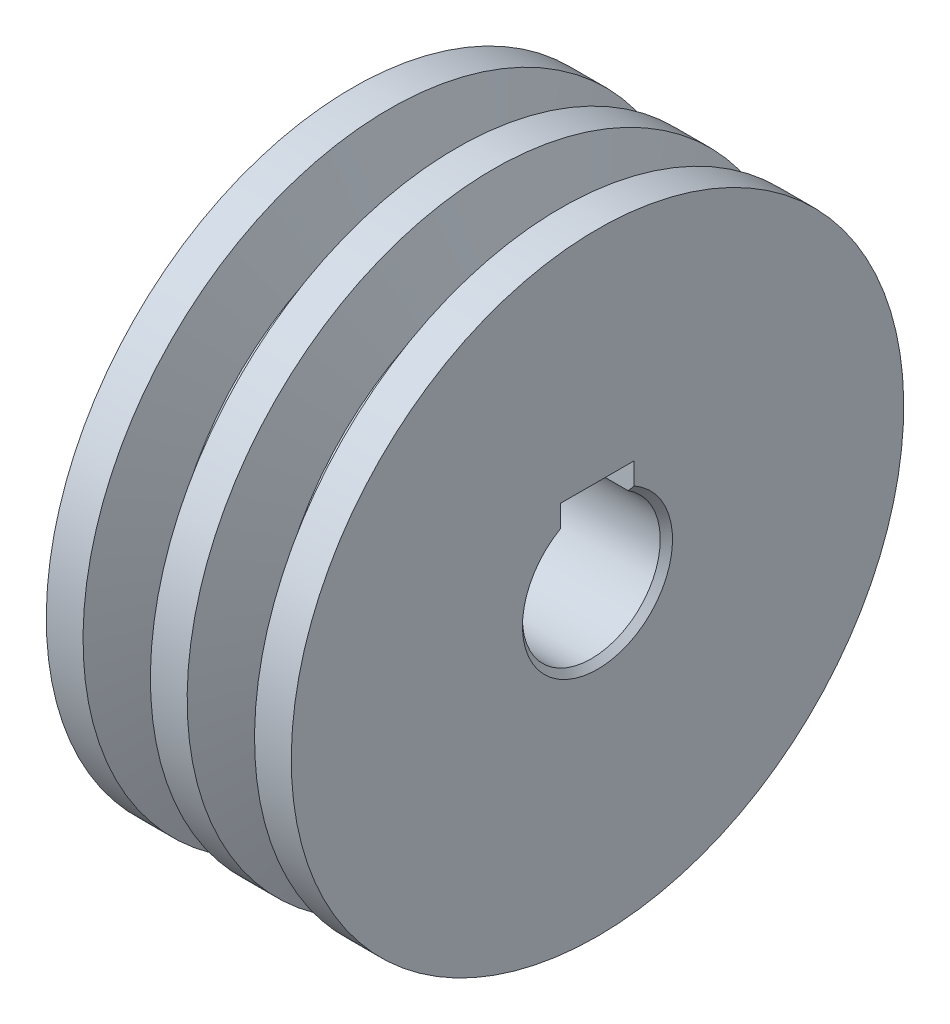
ISO-10303-21;
HEADER;
FILE_DESCRIPTION(('STEP AP214'),'2;1');
FILE_NAME('part.step','',(''),(''),'','','');
FILE_SCHEMA(('AUTOMOTIVE_DESIGN { 1 0 10303 214 1 1 1 1 }'));
ENDSEC;
DATA;
#1=APPLICATION_CONTEXT('core data for automotive mechanical design processes');
#2=APPLICATION_PROTOCOL_DEFINITION('international standard','automotive_design',2000,#1);
#3=PRODUCT_CONTEXT('',#1,'mechanical');
#4=PRODUCT('Part','Part','',(#3));
#5=PRODUCT_RELATED_PRODUCT_CATEGORY('part','',(#4));
#6=PRODUCT_DEFINITION_FORMATION('','',#4);
#7=PRODUCT_DEFINITION_CONTEXT('part definition',#1,'design');
#8=PRODUCT_DEFINITION('design','',#6,#7);
#9=PRODUCT_DEFINITION_SHAPE('','',#8);
#10=(LENGTH_UNIT() NAMED_UNIT(*) SI_UNIT(.MILLI.,.METRE.));
#11=(NAMED_UNIT(*) PLANE_ANGLE_UNIT() SI_UNIT($,.RADIAN.));
#12=(NAMED_UNIT(*) SI_UNIT($,.STERADIAN.) SOLID_ANGLE_UNIT());
#13=UNCERTAINTY_MEASURE_WITH_UNIT(LENGTH_MEASURE(1.E-05),#10,'distance_accuracy_value','');
#14=(GEOMETRIC_REPRESENTATION_CONTEXT(3) GLOBAL_UNCERTAINTY_ASSIGNED_CONTEXT((#13)) GLOBAL_UNIT_ASSIGNED_CONTEXT((#10,
#11,#12)) REPRESENTATION_CONTEXT('',''));
#15=CARTESIAN_POINT('',(0.,0.,0.));
#16=DIRECTION('',(0.,0.,1.));
#17=DIRECTION('',(1.,0.,0.));
#18=AXIS2_PLACEMENT_3D('',#15,#16,#17);
#19=CARTESIAN_POINT('',(-20.,50.,0.));
#20=DIRECTION('',(1.,0.,0.));
#21=DIRECTION('',(0.,1.,0.));
#22=AXIS2_PLACEMENT_3D('',#19,#20,#21);
#23=PLANE('',#22);
#24=CARTESIAN_POINT('',(-20.,0.,0.));
#25=DIRECTION('',(1.,0.,0.));
#26=DIRECTION('',(0.,1.,0.));
#27=AXIS2_PLACEMENT_3D('',#24,#25,#26);
#28=CIRCLE('',#27,25.2);
#29=CARTESIAN_POINT('',(-20.,25.2,0.));
#30=VERTEX_POINT('',#29);
#31=EDGE_CURVE('E188',#30,#30,#28,.T.);
#32=ORIENTED_EDGE('',*,*,#31,.T.);
#33=EDGE_LOOP('',(#32));
#34=FACE_BOUND('',#33,.T.);
#35=CARTESIAN_POINT('',(-20.,0.,0.));
#36=DIRECTION('',(-1.,0.,0.));
#37=DIRECTION('',(0.,-1.,0.));
#38=AXIS2_PLACEMENT_3D('',#35,#36,#37);
#39=CIRCLE('',#38,50.);
#40=CARTESIAN_POINT('',(-20.,-50.,0.));
#41=VERTEX_POINT('',#40);
#42=EDGE_CURVE('E164',#41,#41,#39,.T.);
#43=ORIENTED_EDGE('',*,*,#42,.T.);
#44=EDGE_LOOP('',(#43));
#45=FACE_BOUND('',#44,.T.);
#46=ADVANCED_FACE('F56',(#34,#45),#23,.F.);
#47=CARTESIAN_POINT('',(-2.99999999999999,0.,0.));
#48=DIRECTION('',(1.,0.,0.));
#49=DIRECTION('',(0.,1.,0.));
#50=AXIS2_PLACEMENT_3D('',#47,#48,#49);
#51=CONICAL_SURFACE('',#50,50.,1.22173047639603);
#52=CARTESIAN_POINT('',(-6.63970234266198,0.,0.));
#53=DIRECTION('',(-1.,0.,0.));
#54=DIRECTION('',(0.,-1.,0.));
#55=AXIS2_PLACEMENT_3D('',#52,#53,#54);
#56=CIRCLE('',#55,40.);
#57=CARTESIAN_POINT('',(-6.63970234266198,-40.,0.));
#58=VERTEX_POINT('',#57);
#59=EDGE_CURVE('E154',#58,#58,#56,.T.);
#60=ORIENTED_EDGE('',*,*,#59,.F.);
#61=EDGE_LOOP('',(#60));
#62=FACE_BOUND('',#61,.T.);
#63=CARTESIAN_POINT('',(-2.99999999999999,0.,0.));
#64=DIRECTION('',(-1.,0.,0.));
#65=DIRECTION('',(0.,-1.,0.));
#66=AXIS2_PLACEMENT_3D('',#63,#64,#65);
#67=CIRCLE('',#66,50.);
#68=CARTESIAN_POINT('',(-2.99999999999999,-50.,0.));
#69=VERTEX_POINT('',#68);
#70=EDGE_CURVE('E182',#69,#69,#67,.T.);
#71=ORIENTED_EDGE('',*,*,#70,.T.);
#72=EDGE_LOOP('',(#71));
#73=FACE_BOUND('',#72,.T.);
#74=ADVANCED_FACE('F250',(#62,#73),#51,.T.);
#75=CARTESIAN_POINT('',(-20.,0.,0.));
#76=DIRECTION('',(-1.,0.,0.));
#77=DIRECTION('',(0.,-1.,0.));
#78=AXIS2_PLACEMENT_3D('',#75,#76,#77);
#79=CYLINDRICAL_SURFACE('',#78,50.);
#80=ORIENTED_EDGE('',*,*,#70,.F.);
#81=EDGE_LOOP('',(#80));
#82=FACE_BOUND('',#81,.T.);
#83=CARTESIAN_POINT('',(3.00000000000001,0.,0.));
#84=DIRECTION('',(-1.,0.,0.));
#85=DIRECTION('',(0.,-1.,0.));
#86=AXIS2_PLACEMENT_3D('',#83,#84,#85);
#87=CIRCLE('',#86,50.);
#88=CARTESIAN_POINT('',(3.00000000000001,-50.,0.));
#89=VERTEX_POINT('',#88);
#90=EDGE_CURVE('E179',#89,#89,#87,.T.);
#91=ORIENTED_EDGE('',*,*,#90,.T.);
#92=EDGE_LOOP('',(#91));
#93=FACE_BOUND('',#92,.T.);
#94=ADVANCED_FACE('F269',(#82,#93),#79,.T.);
#95=CARTESIAN_POINT('',(6.63970234266199,0.,0.));
#96=DIRECTION('',(-1.,0.,0.));
#97=DIRECTION('',(0.,-1.,0.));
#98=AXIS2_PLACEMENT_3D('',#95,#96,#97);
#99=CONICAL_SURFACE('',#98,40.,1.22173047639603);
#100=ORIENTED_EDGE('',*,*,#90,.F.);
#101=EDGE_LOOP('',(#100));
#102=FACE_BOUND('',#101,.T.);
#103=CARTESIAN_POINT('',(6.63970234266199,0.,0.));
#104=DIRECTION('',(-1.,0.,0.));
#105=DIRECTION('',(0.,-1.,0.));
#106=AXIS2_PLACEMENT_3D('',#103,#104,#105);
#107=CIRCLE('',#106,40.);
#108=CARTESIAN_POINT('',(6.639702342662,-40.,0.));
#109=VERTEX_POINT('',#108);
#110=EDGE_CURVE('E176',#109,#109,#107,.T.);
#111=ORIENTED_EDGE('',*,*,#110,.T.);
#112=EDGE_LOOP('',(#111));
#113=FACE_BOUND('',#112,.T.);
#114=ADVANCED_FACE('F265',(#102,#113),#99,.T.);
#115=CARTESIAN_POINT('',(-20.,0.,0.));
#116=DIRECTION('',(-1.,0.,0.));
#117=DIRECTION('',(0.,-1.,0.));
#118=AXIS2_PLACEMENT_3D('',#115,#116,#117);
#119=CYLINDRICAL_SURFACE('',#118,40.);
#120=ORIENTED_EDGE('',*,*,#110,.F.);
#121=EDGE_LOOP('',(#120));
#122=FACE_BOUND('',#121,.T.);
#123=CARTESIAN_POINT('',(10.360297657338,0.,0.));
#124=DIRECTION('',(-1.,0.,0.));
#125=DIRECTION('',(0.,-1.,0.));
#126=AXIS2_PLACEMENT_3D('',#123,#124,#125);
#127=CIRCLE('',#126,40.);
#128=CARTESIAN_POINT('',(10.360297657338,-40.,0.));
#129=VERTEX_POINT('',#128);
#130=EDGE_CURVE('E173',#129,#129,#127,.T.);
#131=ORIENTED_EDGE('',*,*,#130,.T.);
#132=EDGE_LOOP('',(#131));
#133=FACE_BOUND('',#132,.T.);
#134=ADVANCED_FACE('F261',(#122,#133),#119,.T.);
#135=CARTESIAN_POINT('',(14.,0.,0.));
#136=DIRECTION('',(1.,0.,0.));
#137=DIRECTION('',(0.,1.,0.));
#138=AXIS2_PLACEMENT_3D('',#135,#136,#137);
#139=CONICAL_SURFACE('',#138,50.,1.22173047639603);
#140=ORIENTED_EDGE('',*,*,#130,.F.);
#141=EDGE_LOOP('',(#140));
#142=FACE_BOUND('',#141,.T.);
#143=CARTESIAN_POINT('',(14.,0.,0.));
#144=DIRECTION('',(-1.,0.,0.));
#145=DIRECTION('',(0.,-1.,0.));
#146=AXIS2_PLACEMENT_3D('',#143,#144,#145);
#147=CIRCLE('',#146,50.);
#148=CARTESIAN_POINT('',(14.,-50.,0.));
#149=VERTEX_POINT('',#148);
#150=EDGE_CURVE('E170',#149,#149,#147,.T.);
#151=ORIENTED_EDGE('',*,*,#150,.T.);
#152=EDGE_LOOP('',(#151));
#153=FACE_BOUND('',#152,.T.);
#154=ADVANCED_FACE('F257',(#142,#153),#139,.T.);
#155=CARTESIAN_POINT('',(-20.,0.,0.));
#156=DIRECTION('',(-1.,0.,0.));
#157=DIRECTION('',(0.,-1.,0.));
#158=AXIS2_PLACEMENT_3D('',#155,#156,#157);
#159=CYLINDRICAL_SURFACE('',#158,50.);
#160=ORIENTED_EDGE('',*,*,#150,.F.);
#161=EDGE_LOOP('',(#160));
#162=FACE_BOUND('',#161,.T.);
#163=CARTESIAN_POINT('',(20.,0.,0.));
#164=DIRECTION('',(-1.,0.,0.));
#165=DIRECTION('',(0.,-1.,0.));
#166=AXIS2_PLACEMENT_3D('',#163,#164,#165);
#167=CIRCLE('',#166,50.);
#168=CARTESIAN_POINT('',(20.,-50.,0.));
#169=VERTEX_POINT('',#168);
#170=EDGE_CURVE('E167',#169,#169,#167,.T.);
#171=ORIENTED_EDGE('',*,*,#170,.T.);
#172=EDGE_LOOP('',(#171));
#173=FACE_BOUND('',#172,.T.);
#174=ADVANCED_FACE('F254',(#162,#173),#159,.T.);
#175=CARTESIAN_POINT('',(20.,50.,0.));
#176=DIRECTION('',(-1.,0.,0.));
#177=DIRECTION('',(0.,-1.,0.));
#178=AXIS2_PLACEMENT_3D('',#175,#176,#177);
#179=PLANE('',#178);
#180=DIRECTION('',(0.,1.,0.));
#181=VECTOR('',#180,1.);
#182=CARTESIAN_POINT('',(20.,8.25,-6.));
#183=LINE('',#182,#181);
#184=CARTESIAN_POINT('',(20.,10.680004681647,-6.));
#185=VERTEX_POINT('',#184);
#186=CARTESIAN_POINT('',(20.,14.25,-6.));
#187=VERTEX_POINT('',#186);
#188=EDGE_CURVE('E113',#185,#187,#183,.T.);
#189=ORIENTED_EDGE('',*,*,#188,.F.);
#190=CARTESIAN_POINT('',(20.,0.,0.));
#191=DIRECTION('',(-1.,0.,0.));
#192=DIRECTION('',(0.,-1.,0.));
#193=AXIS2_PLACEMENT_3D('',#190,#191,#192);
#194=CIRCLE('',#193,12.2500000000001);
#195=CARTESIAN_POINT('',(20.,10.680004681647,6.));
#196=VERTEX_POINT('',#195);
#197=EDGE_CURVE('E191',#185,#196,#194,.T.);
#198=ORIENTED_EDGE('',*,*,#197,.T.);
#199=DIRECTION('',(0.,1.,0.));
#200=VECTOR('',#199,1.);
#201=CARTESIAN_POINT('',(20.,8.25,6.));
#202=LINE('',#201,#200);
#203=CARTESIAN_POINT('',(20.,14.25,6.));
#204=VERTEX_POINT('',#203);
#205=EDGE_CURVE('E140',#196,#204,#202,.T.);
#206=ORIENTED_EDGE('',*,*,#205,.T.);
#207=DIRECTION('',(0.,0.,1.));
#208=VECTOR('',#207,1.);
#209=CARTESIAN_POINT('',(20.,14.25,-6.));
#210=LINE('',#209,#208);
#211=EDGE_CURVE('E124',#187,#204,#210,.T.);
#212=ORIENTED_EDGE('',*,*,#211,.F.);
#213=EDGE_LOOP('',(#189,#198,#206,#212));
#214=FACE_BOUND('',#213,.T.);
#215=ORIENTED_EDGE('',*,*,#170,.F.);
#216=EDGE_LOOP('',(#215));
#217=FACE_BOUND('',#216,.T.);
#218=ADVANCED_FACE('F137',(#214,#217),#179,.F.);
#219=CARTESIAN_POINT('',(-20.,0.,0.));
#220=DIRECTION('',(-1.,0.,0.));
#221=DIRECTION('',(0.,-1.,0.));
#222=AXIS2_PLACEMENT_3D('',#219,#220,#221);
#223=CYLINDRICAL_SURFACE('',#222,50.);
#224=ORIENTED_EDGE('',*,*,#42,.F.);
#225=EDGE_LOOP('',(#224));
#226=FACE_BOUND('',#225,.T.);
#227=CARTESIAN_POINT('',(-14.,0.,0.));
#228=DIRECTION('',(-1.,0.,0.));
#229=DIRECTION('',(0.,-1.,0.));
#230=AXIS2_PLACEMENT_3D('',#227,#228,#229);
#231=CIRCLE('',#230,50.);
#232=CARTESIAN_POINT('',(-14.,-50.,0.));
#233=VERTEX_POINT('',#232);
#234=EDGE_CURVE('E161',#233,#233,#231,.T.);
#235=ORIENTED_EDGE('',*,*,#234,.T.);
#236=EDGE_LOOP('',(#235));
#237=FACE_BOUND('',#236,.T.);
#238=ADVANCED_FACE('F243',(#226,#237),#223,.T.);
#239=CARTESIAN_POINT('',(-10.360297657338,0.,0.));
#240=DIRECTION('',(-1.,0.,0.));
#241=DIRECTION('',(0.,-1.,0.));
#242=AXIS2_PLACEMENT_3D('',#239,#240,#241);
#243=CONICAL_SURFACE('',#242,40.,1.22173047639603);
#244=ORIENTED_EDGE('',*,*,#234,.F.);
#245=EDGE_LOOP('',(#244));
#246=FACE_BOUND('',#245,.T.);
#247=CARTESIAN_POINT('',(-10.360297657338,0.,0.));
#248=DIRECTION('',(-1.,0.,0.));
#249=DIRECTION('',(0.,-1.,0.));
#250=AXIS2_PLACEMENT_3D('',#247,#248,#249);
#251=CIRCLE('',#250,40.);
#252=CARTESIAN_POINT('',(-10.360297657338,-40.,0.));
#253=VERTEX_POINT('',#252);
#254=EDGE_CURVE('E158',#253,#253,#251,.T.);
#255=ORIENTED_EDGE('',*,*,#254,.T.);
#256=EDGE_LOOP('',(#255));
#257=FACE_BOUND('',#256,.T.);
#258=ADVANCED_FACE('F239',(#246,#257),#243,.T.);
#259=CARTESIAN_POINT('',(-20.,0.,0.));
#260=DIRECTION('',(-1.,0.,0.));
#261=DIRECTION('',(0.,-1.,0.));
#262=AXIS2_PLACEMENT_3D('',#259,#260,#261);
#263=CYLINDRICAL_SURFACE('',#262,40.);
#264=ORIENTED_EDGE('',*,*,#254,.F.);
#265=EDGE_LOOP('',(#264));
#266=FACE_BOUND('',#265,.T.);
#267=ORIENTED_EDGE('',*,*,#59,.T.);
#268=EDGE_LOOP('',(#267));
#269=FACE_BOUND('',#268,.T.);
#270=ADVANCED_FACE('F235',(#266,#269),#263,.T.);
#271=CARTESIAN_POINT('',(-30.,0.,0.));
#272=DIRECTION('',(1.,0.,0.));
#273=DIRECTION('',(0.,0.,-1.));
#274=AXIS2_PLACEMENT_3D('',#271,#272,#273);
#275=CYLINDRICAL_SURFACE('',#274,25.);
#276=CARTESIAN_POINT('',(-20.2,0.,0.));
#277=DIRECTION('',(1.,0.,0.));
#278=DIRECTION('',(0.,1.,0.));
#279=AXIS2_PLACEMENT_3D('',#276,#277,#278);
#280=CIRCLE('',#279,25.);
#281=CARTESIAN_POINT('',(-20.2,25.,0.));
#282=VERTEX_POINT('',#281);
#283=EDGE_CURVE('E185',#282,#282,#280,.F.);
#284=ORIENTED_EDGE('',*,*,#283,.T.);
#285=EDGE_LOOP('',(#284));
#286=FACE_BOUND('',#285,.T.);
#287=CARTESIAN_POINT('',(-30.,0.,0.));
#288=DIRECTION('',(-1.,0.,0.));
#289=DIRECTION('',(0.,0.,1.));
#290=AXIS2_PLACEMENT_3D('',#287,#288,#289);
#291=CIRCLE('',#290,25.);
#292=CARTESIAN_POINT('',(-30.,0.,25.));
#293=VERTEX_POINT('',#292);
#294=EDGE_CURVE('E151',#293,#293,#291,.T.);
#295=ORIENTED_EDGE('',*,*,#294,.F.);
#296=EDGE_LOOP('',(#295));
#297=FACE_BOUND('',#296,.T.);
#298=ADVANCED_FACE('F232',(#286,#297),#275,.T.);
#299=CARTESIAN_POINT('',(-30.,0.,0.));
#300=DIRECTION('',(-1.,0.,0.));
#301=DIRECTION('',(0.,0.,1.));
#302=AXIS2_PLACEMENT_3D('',#299,#300,#301);
#303=PLANE('',#302);
#304=DIRECTION('',(0.,1.,0.));
#305=VECTOR('',#304,1.);
#306=CARTESIAN_POINT('',(-30.,8.25,6.));
#307=LINE('',#306,#305);
#308=CARTESIAN_POINT('',(-30.,10.6800046816469,6.));
#309=VERTEX_POINT('',#308);
#310=CARTESIAN_POINT('',(-30.,14.25,6.));
#311=VERTEX_POINT('',#310);
#312=EDGE_CURVE('E125',#309,#311,#307,.T.);
#313=ORIENTED_EDGE('',*,*,#312,.F.);
#314=CARTESIAN_POINT('',(-30.,0.,0.));
#315=DIRECTION('',(-1.,0.,0.));
#316=DIRECTION('',(0.,0.,1.));
#317=AXIS2_PLACEMENT_3D('',#314,#315,#316);
#318=CIRCLE('',#317,12.25);
#319=CARTESIAN_POINT('',(-30.,10.6800046816469,-6.));
#320=VERTEX_POINT('',#319);
#321=EDGE_CURVE('E70',#309,#320,#318,.F.);
#322=ORIENTED_EDGE('',*,*,#321,.T.);
#323=DIRECTION('',(0.,1.,0.));
#324=VECTOR('',#323,1.);
#325=CARTESIAN_POINT('',(-30.,8.25,-6.));
#326=LINE('',#325,#324);
#327=CARTESIAN_POINT('',(-30.,14.25,-6.));
#328=VERTEX_POINT('',#327);
#329=EDGE_CURVE('E146',#320,#328,#326,.T.);
#330=ORIENTED_EDGE('',*,*,#329,.T.);
#331=DIRECTION('',(0.,0.,1.));
#332=VECTOR('',#331,1.);
#333=CARTESIAN_POINT('',(-30.,14.25,-6.));
#334=LINE('',#333,#332);
#335=EDGE_CURVE('E133',#328,#311,#334,.T.);
#336=ORIENTED_EDGE('',*,*,#335,.T.);
#337=EDGE_LOOP('',(#313,#322,#330,#336));
#338=FACE_BOUND('',#337,.T.);
#339=ORIENTED_EDGE('',*,*,#294,.T.);
#340=EDGE_LOOP('',(#339));
#341=FACE_BOUND('',#340,.T.);
#342=ADVANCED_FACE('F228',(#338,#341),#303,.T.);
#343=CARTESIAN_POINT('',(20.,0.,0.));
#344=DIRECTION('',(-1.,0.,0.));
#345=DIRECTION('',(0.,0.,1.));
#346=AXIS2_PLACEMENT_3D('',#343,#344,#345);
#347=CYLINDRICAL_SURFACE('',#346,11.25);
#348=DIRECTION('',(-1.,0.,0.));
#349=VECTOR('',#348,1.);
#350=CARTESIAN_POINT('',(20.,9.51643315533714,-6.));
#351=LINE('',#350,#349);
#352=CARTESIAN_POINT('',(19.,9.51643315533714,-6.));
#353=VERTEX_POINT('',#352);
#354=CARTESIAN_POINT('',(-29.,9.51643315533714,-6.));
#355=VERTEX_POINT('',#354);
#356=EDGE_CURVE('E134',#353,#355,#351,.T.);
#357=ORIENTED_EDGE('',*,*,#356,.T.);
#358=CARTESIAN_POINT('',(-29.,0.,0.));
#359=DIRECTION('',(-1.,0.,0.));
#360=DIRECTION('',(0.,0.,1.));
#361=AXIS2_PLACEMENT_3D('',#358,#359,#360);
#362=CIRCLE('',#361,11.25);
#363=CARTESIAN_POINT('',(-29.,9.51643315533714,6.));
#364=VERTEX_POINT('',#363);
#365=EDGE_CURVE('E219',#355,#364,#362,.T.);
#366=ORIENTED_EDGE('',*,*,#365,.T.);
#367=DIRECTION('',(-1.,0.,0.));
#368=VECTOR('',#367,1.);
#369=CARTESIAN_POINT('',(20.,9.51643315533714,6.));
#370=LINE('',#369,#368);
#371=CARTESIAN_POINT('',(19.,9.51643315533714,6.));
#372=VERTEX_POINT('',#371);
#373=EDGE_CURVE('E155',#372,#364,#370,.T.);
#374=ORIENTED_EDGE('',*,*,#373,.F.);
#375=CARTESIAN_POINT('',(19.,0.,0.));
#376=DIRECTION('',(-1.,0.,0.));
#377=DIRECTION('',(0.,0.,1.));
#378=AXIS2_PLACEMENT_3D('',#375,#376,#377);
#379=CIRCLE('',#378,11.25);
#380=EDGE_CURVE('E200',#372,#353,#379,.F.);
#381=ORIENTED_EDGE('',*,*,#380,.T.);
#382=EDGE_LOOP('',(#357,#366,#374,#381));
#383=FACE_BOUND('',#382,.T.);
#384=ADVANCED_FACE('F211',(#383),#347,.F.);
#385=CARTESIAN_POINT('',(20.,8.25,-6.));
#386=DIRECTION('',(0.,0.,1.));
#387=DIRECTION('',(1.,0.,0.));
#388=AXIS2_PLACEMENT_3D('',#385,#386,#387);
#389=PLANE('',#388);
#390=ORIENTED_EDGE('',*,*,#329,.F.);
#391=CARTESIAN_POINT('',(-30.,10.6800046816469,-6.));
#392=CARTESIAN_POINT('',(-29.9159797734355,10.5836324697057,-6.));
#393=CARTESIAN_POINT('',(-29.8321137512672,10.4871256699428,-6.));
#394=CARTESIAN_POINT('',(-29.6647168381593,10.2938242202487,-6.));
#395=CARTESIAN_POINT('',(-29.5811859425891,10.1970295743271,-6.));
#396=CARTESIAN_POINT('',(-29.4144835331093,10.0031309228389,-6.));
#397=CARTESIAN_POINT('',(-29.3313120198066,9.90602691675042,-6.));
#398=CARTESIAN_POINT('',(-29.1653571501109,9.71148548701325,-6.));
#399=CARTESIAN_POINT('',(-29.082573799117,9.61404805875935,-6.));
#400=CARTESIAN_POINT('',(-29.,9.51643315533714,-6.));
#401=B_SPLINE_CURVE_WITH_KNOTS('',3,(#391,#392,#393,#394,#395,#396,#397,#398,#399,#400),
.UNSPECIFIED.,.F.,.F.,(4,2,2,2,4),(0.,0.383566177130474,0.76712703607915,1.1506885424445,
1.53425536807429),.UNSPECIFIED.);
#402=EDGE_CURVE('E12',#320,#355,#401,.T.);
#403=ORIENTED_EDGE('',*,*,#402,.T.);
#404=ORIENTED_EDGE('',*,*,#356,.F.);
#405=CARTESIAN_POINT('',(19.,9.51643315533714,-6.));
#406=CARTESIAN_POINT('',(19.082573799117,9.61404805875935,-6.));
#407=CARTESIAN_POINT('',(19.1653571501109,9.71148548701326,-6.));
#408=CARTESIAN_POINT('',(19.3313120198065,9.90602691675045,-6.));
#409=CARTESIAN_POINT('',(19.4144835331093,10.0031309228389,-6.));
#410=CARTESIAN_POINT('',(19.581185942589,10.1970295743271,-6.));
#411=CARTESIAN_POINT('',(19.6647168381593,10.2938242202487,-6.));
#412=CARTESIAN_POINT('',(19.8321137512672,10.4871256699429,-6.));
#413=CARTESIAN_POINT('',(19.9159797734355,10.5836324697058,-6.));
#414=CARTESIAN_POINT('',(20.,10.680004681647,-6.));
#415=B_SPLINE_CURVE_WITH_KNOTS('',3,(#405,#406,#407,#408,#409,#410,#411,#412,#413,#414),
.UNSPECIFIED.,.F.,.F.,(4,2,2,2,4),(0.,0.38356682562982,0.767128331995192,1.1506891909439,
1.53425536807439),.UNSPECIFIED.);
#416=EDGE_CURVE('E119',#353,#185,#415,.T.);
#417=ORIENTED_EDGE('',*,*,#416,.T.);
#418=ORIENTED_EDGE('',*,*,#188,.T.);
#419=DIRECTION('',(-1.,0.,0.));
#420=VECTOR('',#419,1.);
#421=CARTESIAN_POINT('',(20.,14.25,-6.));
#422=LINE('',#421,#420);
#423=EDGE_CURVE('E116',#187,#328,#422,.T.);
#424=ORIENTED_EDGE('',*,*,#423,.T.);
#425=EDGE_LOOP('',(#390,#403,#404,#417,#418,#424));
#426=FACE_BOUND('',#425,.T.);
#427=ADVANCED_FACE('F115',(#426),#389,.T.);
#428=CARTESIAN_POINT('',(20.,14.25,-6.));
#429=DIRECTION('',(0.,-1.,0.));
#430=DIRECTION('',(0.,0.,-1.));
#431=AXIS2_PLACEMENT_3D('',#428,#429,#430);
#432=PLANE('',#431);
#433=ORIENTED_EDGE('',*,*,#335,.F.);
#434=ORIENTED_EDGE('',*,*,#423,.F.);
#435=ORIENTED_EDGE('',*,*,#211,.T.);
#436=DIRECTION('',(-1.,0.,0.));
#437=VECTOR('',#436,1.);
#438=CARTESIAN_POINT('',(20.,14.25,6.));
#439=LINE('',#438,#437);
#440=EDGE_CURVE('E135',#204,#311,#439,.T.);
#441=ORIENTED_EDGE('',*,*,#440,.T.);
#442=EDGE_LOOP('',(#433,#434,#435,#441));
#443=FACE_BOUND('',#442,.T.);
#444=ADVANCED_FACE('F130',(#443),#432,.T.);
#445=CARTESIAN_POINT('',(20.,8.25,6.));
#446=DIRECTION('',(0.,0.,1.));
#447=DIRECTION('',(1.,0.,0.));
#448=AXIS2_PLACEMENT_3D('',#445,#446,#447);
#449=PLANE('',#448);
#450=ORIENTED_EDGE('',*,*,#373,.T.);
#451=CARTESIAN_POINT('',(-29.,9.51643315533714,6.));
#452=CARTESIAN_POINT('',(-29.082573799117,9.61404805875935,6.));
#453=CARTESIAN_POINT('',(-29.1653571501109,9.71148548701325,6.));
#454=CARTESIAN_POINT('',(-29.3313120198066,9.90602691675042,6.));
#455=CARTESIAN_POINT('',(-29.4144835331093,10.0031309228389,6.));
#456=CARTESIAN_POINT('',(-29.5811859425891,10.1970295743271,6.));
#457=CARTESIAN_POINT('',(-29.6647168381593,10.2938242202487,6.));
#458=CARTESIAN_POINT('',(-29.8321137512672,10.4871256699428,6.));
#459=CARTESIAN_POINT('',(-29.9159797734355,10.5836324697057,6.));
#460=CARTESIAN_POINT('',(-30.,10.6800046816469,6.));
#461=B_SPLINE_CURVE_WITH_KNOTS('',3,(#451,#452,#453,#454,#455,#456,#457,#458,#459,#460),
.UNSPECIFIED.,.F.,.F.,(4,2,2,2,4),(0.,0.383566825629796,0.767128331995143,1.15068919094382,
1.53425536807429),.UNSPECIFIED.);
#462=EDGE_CURVE('E84',#364,#309,#461,.T.);
#463=ORIENTED_EDGE('',*,*,#462,.T.);
#464=ORIENTED_EDGE('',*,*,#312,.T.);
#465=ORIENTED_EDGE('',*,*,#440,.F.);
#466=ORIENTED_EDGE('',*,*,#205,.F.);
#467=CARTESIAN_POINT('',(20.,10.680004681647,6.));
#468=CARTESIAN_POINT('',(19.9159797734355,10.5836324697058,6.));
#469=CARTESIAN_POINT('',(19.8321137512672,10.4871256699429,6.));
#470=CARTESIAN_POINT('',(19.6647168381593,10.2938242202487,6.));
#471=CARTESIAN_POINT('',(19.581185942589,10.1970295743271,6.));
#472=CARTESIAN_POINT('',(19.4144835331093,10.0031309228389,6.));
#473=CARTESIAN_POINT('',(19.3313120198065,9.90602691675044,6.));
#474=CARTESIAN_POINT('',(19.1653571501109,9.71148548701326,6.));
#475=CARTESIAN_POINT('',(19.082573799117,9.61404805875935,6.));
#476=CARTESIAN_POINT('',(19.,9.51643315533714,6.));
#477=B_SPLINE_CURVE_WITH_KNOTS('',3,(#467,#468,#469,#470,#471,#472,#473,#474,#475,#476),
.UNSPECIFIED.,.F.,.F.,(4,2,2,2,4),(0.,0.3835661771305,0.767127036079202,1.15068854244457,
1.53425536807439),.UNSPECIFIED.);
#478=EDGE_CURVE('E193',#196,#372,#477,.T.);
#479=ORIENTED_EDGE('',*,*,#478,.T.);
#480=EDGE_LOOP('',(#450,#463,#464,#465,#466,#479));
#481=FACE_BOUND('',#480,.T.);
#482=ADVANCED_FACE('F205',(#481),#449,.F.);
#483=CARTESIAN_POINT('',(-20.2,0.,0.));
#484=DIRECTION('',(1.,0.,0.));
#485=DIRECTION('',(0.,1.,0.));
#486=AXIS2_PLACEMENT_3D('',#483,#484,#485);
#487=TOROIDAL_SURFACE('',#486,25.2,0.2);
#488=ORIENTED_EDGE('',*,*,#31,.F.);
#489=EDGE_LOOP('',(#488));
#490=FACE_BOUND('',#489,.T.);
#491=ORIENTED_EDGE('',*,*,#283,.F.);
#492=EDGE_LOOP('',(#491));
#493=FACE_BOUND('',#492,.T.);
#494=ADVANCED_FACE('F210',(#490,#493),#487,.F.);
#495=CARTESIAN_POINT('',(20.,0.,0.));
#496=DIRECTION('',(1.,0.,0.));
#497=DIRECTION('',(0.,0.,-1.));
#498=AXIS2_PLACEMENT_3D('',#495,#496,#497);
#499=CONICAL_SURFACE('',#498,12.2500000000001,0.785398163397453);
#500=ORIENTED_EDGE('',*,*,#416,.F.);
#501=ORIENTED_EDGE('',*,*,#380,.F.);
#502=ORIENTED_EDGE('',*,*,#478,.F.);
#503=ORIENTED_EDGE('',*,*,#197,.F.);
#504=EDGE_LOOP('',(#500,#501,#502,#503));
#505=FACE_BOUND('',#504,.T.);
#506=ADVANCED_FACE('F202',(#505),#499,.F.);
#507=CARTESIAN_POINT('',(-29.,0.,0.));
#508=DIRECTION('',(-1.,0.,0.));
#509=DIRECTION('',(0.,0.,1.));
#510=AXIS2_PLACEMENT_3D('',#507,#508,#509);
#511=CONICAL_SURFACE('',#510,11.25,0.785398163397448);
#512=ORIENTED_EDGE('',*,*,#402,.F.);
#513=ORIENTED_EDGE('',*,*,#321,.F.);
#514=ORIENTED_EDGE('',*,*,#462,.F.);
#515=ORIENTED_EDGE('',*,*,#365,.F.);
#516=EDGE_LOOP('',(#512,#513,#514,#515));
#517=FACE_BOUND('',#516,.T.);
#518=ADVANCED_FACE('F58',(#517),#511,.F.);
#519=CLOSED_SHELL('',(#46,#74,#94,#114,#134,#154,#174,#218,#238,#258,#270,#298,#342,#384,#427,
#444,#482,#494,#506,#518));
#520=MANIFOLD_SOLID_BREP('B2',#519);
#521=ADVANCED_BREP_SHAPE_REPRESENTATION('',(#18,#520),#14);
#522=SHAPE_DEFINITION_REPRESENTATION(#9,#521);
ENDSEC;
END-ISO-10303-21;
